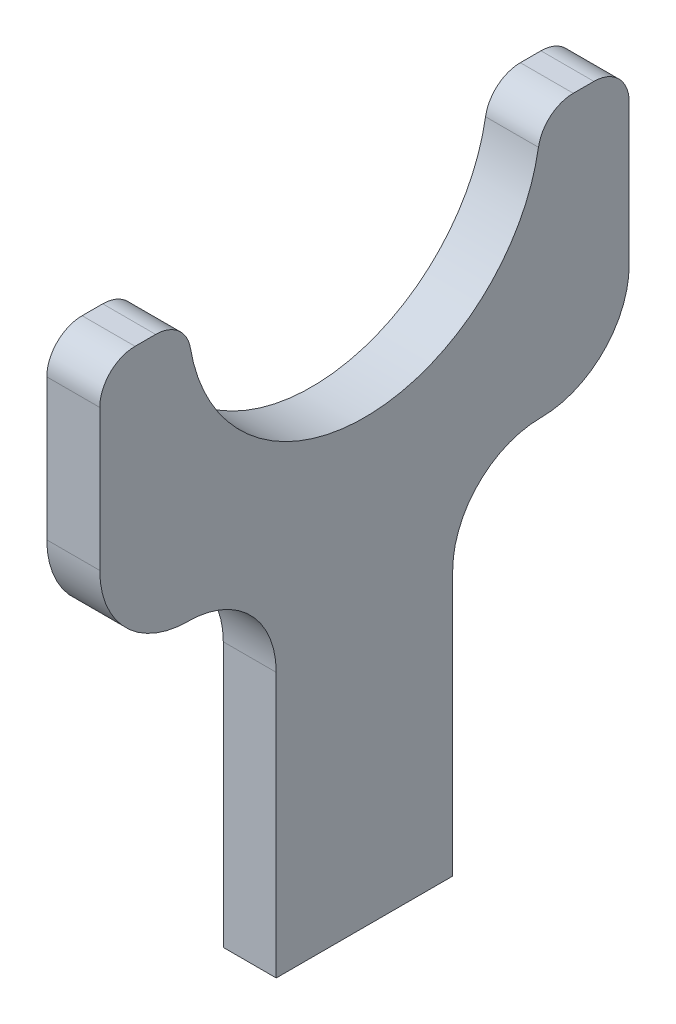
ISO-10303-21;
HEADER;
FILE_DESCRIPTION(('STEP AP214'),'2;1');
FILE_NAME('part.step','',(''),(''),'','','');
FILE_SCHEMA(('AUTOMOTIVE_DESIGN { 1 0 10303 214 1 1 1 1 }'));
ENDSEC;
DATA;
#1=APPLICATION_CONTEXT('core data for automotive mechanical design processes');
#2=APPLICATION_PROTOCOL_DEFINITION('international standard','automotive_design',2000,#1);
#3=PRODUCT_CONTEXT('',#1,'mechanical');
#4=PRODUCT('Part','Part','',(#3));
#5=PRODUCT_RELATED_PRODUCT_CATEGORY('part','',(#4));
#6=PRODUCT_DEFINITION_FORMATION('','',#4);
#7=PRODUCT_DEFINITION_CONTEXT('part definition',#1,'design');
#8=PRODUCT_DEFINITION('design','',#6,#7);
#9=PRODUCT_DEFINITION_SHAPE('','',#8);
#10=(LENGTH_UNIT() NAMED_UNIT(*) SI_UNIT(.MILLI.,.METRE.));
#11=(NAMED_UNIT(*) PLANE_ANGLE_UNIT() SI_UNIT($,.RADIAN.));
#12=(NAMED_UNIT(*) SI_UNIT($,.STERADIAN.) SOLID_ANGLE_UNIT());
#13=UNCERTAINTY_MEASURE_WITH_UNIT(LENGTH_MEASURE(1.E-05),#10,'distance_accuracy_value','');
#14=(GEOMETRIC_REPRESENTATION_CONTEXT(3) GLOBAL_UNCERTAINTY_ASSIGNED_CONTEXT((#13)) GLOBAL_UNIT_ASSIGNED_CONTEXT((#10,
#11,#12)) REPRESENTATION_CONTEXT('',''));
#15=CARTESIAN_POINT('',(0.,0.,0.));
#16=DIRECTION('',(0.,0.,1.));
#17=DIRECTION('',(1.,0.,0.));
#18=AXIS2_PLACEMENT_3D('',#15,#16,#17);
#19=CARTESIAN_POINT('',(3.,35.,0.));
#20=DIRECTION('',(0.,-1.,0.));
#21=DIRECTION('',(0.,0.,-1.));
#22=AXIS2_PLACEMENT_3D('',#19,#20,#21);
#23=PLANE('',#22);
#24=DIRECTION('',(0.,0.,1.));
#25=VECTOR('',#24,1.);
#26=CARTESIAN_POINT('',(3.,35.,0.));
#27=LINE('',#26,#25);
#28=CARTESIAN_POINT('',(3.,35.,-28.));
#29=VERTEX_POINT('',#28);
#30=CARTESIAN_POINT('',(3.,35.,-26.8321595661992));
#31=VERTEX_POINT('',#30);
#32=EDGE_CURVE('E189',#29,#31,#27,.T.);
#33=ORIENTED_EDGE('',*,*,#32,.F.);
#34=DIRECTION('',(-1.,0.,0.));
#35=VECTOR('',#34,1.);
#36=CARTESIAN_POINT('',(3.,35.,-28.));
#37=LINE('',#36,#35);
#38=CARTESIAN_POINT('',(0.,35.,-28.));
#39=VERTEX_POINT('',#38);
#40=EDGE_CURVE('E225',#29,#39,#37,.T.);
#41=ORIENTED_EDGE('',*,*,#40,.T.);
#42=DIRECTION('',(0.,0.,1.));
#43=VECTOR('',#42,1.);
#44=CARTESIAN_POINT('',(0.,35.,0.));
#45=LINE('',#44,#43);
#46=CARTESIAN_POINT('',(0.,35.,-26.8321595661992));
#47=VERTEX_POINT('',#46);
#48=EDGE_CURVE('E184',#39,#47,#45,.T.);
#49=ORIENTED_EDGE('',*,*,#48,.T.);
#50=DIRECTION('',(1.,0.,0.));
#51=VECTOR('',#50,1.);
#52=CARTESIAN_POINT('',(3.,35.,-26.8321595661992));
#53=LINE('',#52,#51);
#54=EDGE_CURVE('E215',#47,#31,#53,.T.);
#55=ORIENTED_EDGE('',*,*,#54,.T.);
#56=EDGE_LOOP('',(#33,#41,#49,#55));
#57=FACE_BOUND('',#56,.T.);
#58=ADVANCED_FACE('F33',(#57),#23,.F.);
#59=CARTESIAN_POINT('',(3.,0.,0.));
#60=DIRECTION('',(0.,0.,-1.));
#61=DIRECTION('',(-1.,0.,0.));
#62=AXIS2_PLACEMENT_3D('',#59,#60,#61);
#63=PLANE('',#62);
#64=DIRECTION('',(0.,-1.,0.));
#65=VECTOR('',#64,1.);
#66=CARTESIAN_POINT('',(3.,0.,0.));
#67=LINE('',#66,#65);
#68=CARTESIAN_POINT('',(3.,33.,0.));
#69=VERTEX_POINT('',#68);
#70=CARTESIAN_POINT('',(3.,25.,0.));
#71=VERTEX_POINT('',#70);
#72=EDGE_CURVE('E262',#69,#71,#67,.T.);
#73=ORIENTED_EDGE('',*,*,#72,.F.);
#74=DIRECTION('',(-1.,0.,0.));
#75=VECTOR('',#74,1.);
#76=CARTESIAN_POINT('',(3.,33.,0.));
#77=LINE('',#76,#75);
#78=CARTESIAN_POINT('',(0.,33.,0.));
#79=VERTEX_POINT('',#78);
#80=EDGE_CURVE('E11',#69,#79,#77,.T.);
#81=ORIENTED_EDGE('',*,*,#80,.T.);
#82=DIRECTION('',(0.,-1.,0.));
#83=VECTOR('',#82,1.);
#84=CARTESIAN_POINT('',(0.,0.,0.));
#85=LINE('',#84,#83);
#86=CARTESIAN_POINT('',(0.,25.,0.));
#87=VERTEX_POINT('',#86);
#88=EDGE_CURVE('E168',#79,#87,#85,.T.);
#89=ORIENTED_EDGE('',*,*,#88,.T.);
#90=DIRECTION('',(1.,0.,0.));
#91=VECTOR('',#90,1.);
#92=CARTESIAN_POINT('',(3.,25.,0.));
#93=LINE('',#92,#91);
#94=EDGE_CURVE('E203',#87,#71,#93,.T.);
#95=ORIENTED_EDGE('',*,*,#94,.T.);
#96=EDGE_LOOP('',(#73,#81,#89,#95));
#97=FACE_BOUND('',#96,.T.);
#98=ADVANCED_FACE('F261',(#97),#63,.F.);
#99=CARTESIAN_POINT('',(3.,0.,0.));
#100=DIRECTION('',(0.,1.,0.));
#101=DIRECTION('',(0.,0.,1.));
#102=AXIS2_PLACEMENT_3D('',#99,#100,#101);
#103=PLANE('',#102);
#104=DIRECTION('',(0.,0.,-1.));
#105=VECTOR('',#104,1.);
#106=CARTESIAN_POINT('',(3.,0.,0.));
#107=LINE('',#106,#105);
#108=CARTESIAN_POINT('',(3.,0.,-10.));
#109=VERTEX_POINT('',#108);
#110=CARTESIAN_POINT('',(3.,0.,-20.));
#111=VERTEX_POINT('',#110);
#112=EDGE_CURVE('E167',#109,#111,#107,.T.);
#113=ORIENTED_EDGE('',*,*,#112,.F.);
#114=DIRECTION('',(1.,0.,0.));
#115=VECTOR('',#114,1.);
#116=CARTESIAN_POINT('',(0.,0.,-10.));
#117=LINE('',#116,#115);
#118=CARTESIAN_POINT('',(0.,0.,-10.));
#119=VERTEX_POINT('',#118);
#120=EDGE_CURVE('E151',#119,#109,#117,.T.);
#121=ORIENTED_EDGE('',*,*,#120,.F.);
#122=DIRECTION('',(0.,0.,-1.));
#123=VECTOR('',#122,1.);
#124=CARTESIAN_POINT('',(0.,0.,0.));
#125=LINE('',#124,#123);
#126=CARTESIAN_POINT('',(0.,0.,-20.));
#127=VERTEX_POINT('',#126);
#128=EDGE_CURVE('E165',#119,#127,#125,.T.);
#129=ORIENTED_EDGE('',*,*,#128,.T.);
#130=DIRECTION('',(1.,0.,0.));
#131=VECTOR('',#130,1.);
#132=CARTESIAN_POINT('',(0.,0.,-20.));
#133=LINE('',#132,#131);
#134=EDGE_CURVE('E270',#127,#111,#133,.T.);
#135=ORIENTED_EDGE('',*,*,#134,.T.);
#136=EDGE_LOOP('',(#113,#121,#129,#135));
#137=FACE_BOUND('',#136,.T.);
#138=ADVANCED_FACE('F163',(#137),#103,.F.);
#139=CARTESIAN_POINT('',(3.,0.,-30.));
#140=DIRECTION('',(0.,0.,1.));
#141=DIRECTION('',(1.,0.,0.));
#142=AXIS2_PLACEMENT_3D('',#139,#140,#141);
#143=PLANE('',#142);
#144=DIRECTION('',(0.,1.,0.));
#145=VECTOR('',#144,1.);
#146=CARTESIAN_POINT('',(0.,0.,-30.));
#147=LINE('',#146,#145);
#148=CARTESIAN_POINT('',(0.,25.,-30.));
#149=VERTEX_POINT('',#148);
#150=CARTESIAN_POINT('',(0.,33.,-30.));
#151=VERTEX_POINT('',#150);
#152=EDGE_CURVE('E175',#149,#151,#147,.T.);
#153=ORIENTED_EDGE('',*,*,#152,.T.);
#154=DIRECTION('',(-1.,0.,0.));
#155=VECTOR('',#154,1.);
#156=CARTESIAN_POINT('',(3.,33.,-30.));
#157=LINE('',#156,#155);
#158=CARTESIAN_POINT('',(3.,33.,-30.));
#159=VERTEX_POINT('',#158);
#160=EDGE_CURVE('E236',#151,#159,#157,.F.);
#161=ORIENTED_EDGE('',*,*,#160,.T.);
#162=DIRECTION('',(0.,1.,0.));
#163=VECTOR('',#162,1.);
#164=CARTESIAN_POINT('',(3.,0.,-30.));
#165=LINE('',#164,#163);
#166=CARTESIAN_POINT('',(3.,25.,-30.));
#167=VERTEX_POINT('',#166);
#168=EDGE_CURVE('E266',#167,#159,#165,.T.);
#169=ORIENTED_EDGE('',*,*,#168,.F.);
#170=DIRECTION('',(1.,0.,0.));
#171=VECTOR('',#170,1.);
#172=CARTESIAN_POINT('',(3.,25.,-30.));
#173=LINE('',#172,#171);
#174=EDGE_CURVE('E193',#167,#149,#173,.F.);
#175=ORIENTED_EDGE('',*,*,#174,.T.);
#176=EDGE_LOOP('',(#153,#161,#169,#175));
#177=FACE_BOUND('',#176,.T.);
#178=ADVANCED_FACE('F288',(#177),#143,.F.);
#179=CARTESIAN_POINT('',(3.,35.,-3.16784043380077));
#180=VERTEX_POINT('',#179);
#181=CARTESIAN_POINT('',(3.,35.,-2.));
#182=VERTEX_POINT('',#181);
#183=EDGE_CURVE('E253',#180,#182,#27,.T.);
#184=ORIENTED_EDGE('',*,*,#183,.F.);
#185=DIRECTION('',(1.,0.,0.));
#186=VECTOR('',#185,1.);
#187=CARTESIAN_POINT('',(3.,35.,-3.16784043380077));
#188=LINE('',#187,#186);
#189=CARTESIAN_POINT('',(0.,35.,-3.16784043380077));
#190=VERTEX_POINT('',#189);
#191=EDGE_CURVE('E41',#180,#190,#188,.F.);
#192=ORIENTED_EDGE('',*,*,#191,.T.);
#193=CARTESIAN_POINT('',(0.,35.,-2.));
#194=VERTEX_POINT('',#193);
#195=EDGE_CURVE('E178',#190,#194,#45,.T.);
#196=ORIENTED_EDGE('',*,*,#195,.T.);
#197=DIRECTION('',(-1.,0.,0.));
#198=VECTOR('',#197,1.);
#199=CARTESIAN_POINT('',(3.,35.,-2.));
#200=LINE('',#199,#198);
#201=EDGE_CURVE('E56',#194,#182,#200,.F.);
#202=ORIENTED_EDGE('',*,*,#201,.T.);
#203=EDGE_LOOP('',(#184,#192,#196,#202));
#204=FACE_BOUND('',#203,.T.);
#205=ADVANCED_FACE('F252',(#204),#23,.F.);
#206=CARTESIAN_POINT('',(3.,0.,0.));
#207=DIRECTION('',(-1.,0.,0.));
#208=DIRECTION('',(0.,0.,1.));
#209=AXIS2_PLACEMENT_3D('',#206,#207,#208);
#210=PLANE('',#209);
#211=ORIENTED_EDGE('',*,*,#168,.T.);
#212=CARTESIAN_POINT('',(3.,33.,-28.));
#213=DIRECTION('',(-1.,0.,0.));
#214=DIRECTION('',(0.,0.,1.));
#215=AXIS2_PLACEMENT_3D('',#212,#213,#214);
#216=CIRCLE('',#215,2.);
#217=EDGE_CURVE('E243',#159,#29,#216,.F.);
#218=ORIENTED_EDGE('',*,*,#217,.T.);
#219=ORIENTED_EDGE('',*,*,#32,.T.);
#220=CARTESIAN_POINT('',(3.,33.,-26.8321595661992));
#221=DIRECTION('',(-1.,0.,0.));
#222=DIRECTION('',(0.,0.,1.));
#223=AXIS2_PLACEMENT_3D('',#220,#221,#222);
#224=CIRCLE('',#223,2.);
#225=CARTESIAN_POINT('',(3.,33.3333333333333,-24.8601329718327));
#226=VERTEX_POINT('',#225);
#227=EDGE_CURVE('E241',#31,#226,#224,.F.);
#228=ORIENTED_EDGE('',*,*,#227,.T.);
#229=CARTESIAN_POINT('',(3.,35.,-15.));
#230=DIRECTION('',(1.,0.,0.));
#231=DIRECTION('',(0.,0.,-1.));
#232=AXIS2_PLACEMENT_3D('',#229,#230,#231);
#233=CIRCLE('',#232,10.);
#234=CARTESIAN_POINT('',(3.,33.3333333333333,-5.1398670281673));
#235=VERTEX_POINT('',#234);
#236=EDGE_CURVE('E219',#235,#226,#233,.T.);
#237=ORIENTED_EDGE('',*,*,#236,.F.);
#238=CARTESIAN_POINT('',(3.,33.,-3.16784043380077));
#239=DIRECTION('',(-1.,0.,0.));
#240=DIRECTION('',(0.,0.,1.));
#241=AXIS2_PLACEMENT_3D('',#238,#239,#240);
#242=CIRCLE('',#241,2.);
#243=EDGE_CURVE('E239',#235,#180,#242,.F.);
#244=ORIENTED_EDGE('',*,*,#243,.T.);
#245=ORIENTED_EDGE('',*,*,#183,.T.);
#246=CARTESIAN_POINT('',(3.,33.,-2.));
#247=DIRECTION('',(-1.,0.,0.));
#248=DIRECTION('',(0.,0.,1.));
#249=AXIS2_PLACEMENT_3D('',#246,#247,#248);
#250=CIRCLE('',#249,2.);
#251=EDGE_CURVE('E48',#182,#69,#250,.F.);
#252=ORIENTED_EDGE('',*,*,#251,.T.);
#253=ORIENTED_EDGE('',*,*,#72,.T.);
#254=CARTESIAN_POINT('',(3.,25.,-5.));
#255=DIRECTION('',(-1.,0.,0.));
#256=DIRECTION('',(0.,0.,1.));
#257=AXIS2_PLACEMENT_3D('',#254,#255,#256);
#258=CIRCLE('',#257,5.);
#259=CARTESIAN_POINT('',(3.,20.,-5.));
#260=VERTEX_POINT('',#259);
#261=EDGE_CURVE('E188',#71,#260,#258,.F.);
#262=ORIENTED_EDGE('',*,*,#261,.T.);
#263=CARTESIAN_POINT('',(3.,15.,-5.));
#264=DIRECTION('',(-1.,0.,0.));
#265=DIRECTION('',(0.,0.,1.));
#266=AXIS2_PLACEMENT_3D('',#263,#264,#265);
#267=CIRCLE('',#266,5.);
#268=CARTESIAN_POINT('',(3.,15.,-10.));
#269=VERTEX_POINT('',#268);
#270=EDGE_CURVE('E211',#260,#269,#267,.T.);
#271=ORIENTED_EDGE('',*,*,#270,.T.);
#272=DIRECTION('',(0.,1.,0.));
#273=VECTOR('',#272,1.);
#274=CARTESIAN_POINT('',(3.,0.,-10.));
#275=LINE('',#274,#273);
#276=EDGE_CURVE('E158',#109,#269,#275,.T.);
#277=ORIENTED_EDGE('',*,*,#276,.F.);
#278=ORIENTED_EDGE('',*,*,#112,.T.);
#279=DIRECTION('',(0.,-1.,0.));
#280=VECTOR('',#279,1.);
#281=CARTESIAN_POINT('',(3.,0.,-20.));
#282=LINE('',#281,#280);
#283=CARTESIAN_POINT('',(3.,15.,-20.));
#284=VERTEX_POINT('',#283);
#285=EDGE_CURVE('E303',#284,#111,#282,.T.);
#286=ORIENTED_EDGE('',*,*,#285,.F.);
#287=CARTESIAN_POINT('',(3.,15.,-25.));
#288=DIRECTION('',(-1.,0.,0.));
#289=DIRECTION('',(0.,0.,1.));
#290=AXIS2_PLACEMENT_3D('',#287,#288,#289);
#291=CIRCLE('',#290,5.);
#292=CARTESIAN_POINT('',(3.,20.,-25.));
#293=VERTEX_POINT('',#292);
#294=EDGE_CURVE('E207',#284,#293,#291,.T.);
#295=ORIENTED_EDGE('',*,*,#294,.T.);
#296=CARTESIAN_POINT('',(3.,25.,-25.));
#297=DIRECTION('',(-1.,0.,0.));
#298=DIRECTION('',(0.,0.,1.));
#299=AXIS2_PLACEMENT_3D('',#296,#297,#298);
#300=CIRCLE('',#299,5.);
#301=EDGE_CURVE('E191',#293,#167,#300,.F.);
#302=ORIENTED_EDGE('',*,*,#301,.T.);
#303=EDGE_LOOP('',(#211,#218,#219,#228,#237,#244,#245,#252,#253,#262,#271,#277,#278,#286,#295,#302));
#304=FACE_BOUND('',#303,.T.);
#305=ADVANCED_FACE('F276',(#304),#210,.F.);
#306=CARTESIAN_POINT('',(0.,0.,0.));
#307=DIRECTION('',(-1.,0.,0.));
#308=DIRECTION('',(0.,0.,1.));
#309=AXIS2_PLACEMENT_3D('',#306,#307,#308);
#310=PLANE('',#309);
#311=ORIENTED_EDGE('',*,*,#48,.F.);
#312=CARTESIAN_POINT('',(0.,33.,-28.));
#313=DIRECTION('',(-1.,0.,0.));
#314=DIRECTION('',(0.,0.,1.));
#315=AXIS2_PLACEMENT_3D('',#312,#313,#314);
#316=CIRCLE('',#315,2.);
#317=EDGE_CURVE('E234',#39,#151,#316,.T.);
#318=ORIENTED_EDGE('',*,*,#317,.T.);
#319=ORIENTED_EDGE('',*,*,#152,.F.);
#320=CARTESIAN_POINT('',(0.,25.,-25.));
#321=DIRECTION('',(-1.,0.,0.));
#322=DIRECTION('',(0.,0.,1.));
#323=AXIS2_PLACEMENT_3D('',#320,#321,#322);
#324=CIRCLE('',#323,5.);
#325=CARTESIAN_POINT('',(0.,20.,-25.));
#326=VERTEX_POINT('',#325);
#327=EDGE_CURVE('E199',#149,#326,#324,.T.);
#328=ORIENTED_EDGE('',*,*,#327,.T.);
#329=CARTESIAN_POINT('',(0.,15.,-25.));
#330=DIRECTION('',(-1.,0.,0.));
#331=DIRECTION('',(0.,0.,1.));
#332=AXIS2_PLACEMENT_3D('',#329,#330,#331);
#333=CIRCLE('',#332,5.);
#334=CARTESIAN_POINT('',(0.,15.,-20.));
#335=VERTEX_POINT('',#334);
#336=EDGE_CURVE('E209',#326,#335,#333,.F.);
#337=ORIENTED_EDGE('',*,*,#336,.T.);
#338=DIRECTION('',(0.,-1.,0.));
#339=VECTOR('',#338,1.);
#340=CARTESIAN_POINT('',(0.,0.,-20.));
#341=LINE('',#340,#339);
#342=EDGE_CURVE('E173',#335,#127,#341,.T.);
#343=ORIENTED_EDGE('',*,*,#342,.T.);
#344=ORIENTED_EDGE('',*,*,#128,.F.);
#345=DIRECTION('',(0.,1.,0.));
#346=VECTOR('',#345,1.);
#347=CARTESIAN_POINT('',(0.,0.,-10.));
#348=LINE('',#347,#346);
#349=CARTESIAN_POINT('',(0.,15.,-10.));
#350=VERTEX_POINT('',#349);
#351=EDGE_CURVE('E147',#119,#350,#348,.T.);
#352=ORIENTED_EDGE('',*,*,#351,.T.);
#353=CARTESIAN_POINT('',(0.,15.,-5.));
#354=DIRECTION('',(-1.,0.,0.));
#355=DIRECTION('',(0.,0.,1.));
#356=AXIS2_PLACEMENT_3D('',#353,#354,#355);
#357=CIRCLE('',#356,5.);
#358=CARTESIAN_POINT('',(0.,20.,-5.));
#359=VERTEX_POINT('',#358);
#360=EDGE_CURVE('E213',#350,#359,#357,.F.);
#361=ORIENTED_EDGE('',*,*,#360,.T.);
#362=CARTESIAN_POINT('',(0.,25.,-5.));
#363=DIRECTION('',(-1.,0.,0.));
#364=DIRECTION('',(0.,0.,1.));
#365=AXIS2_PLACEMENT_3D('',#362,#363,#364);
#366=CIRCLE('',#365,5.);
#367=EDGE_CURVE('E196',#359,#87,#366,.T.);
#368=ORIENTED_EDGE('',*,*,#367,.T.);
#369=ORIENTED_EDGE('',*,*,#88,.F.);
#370=CARTESIAN_POINT('',(0.,33.,-2.));
#371=DIRECTION('',(-1.,0.,0.));
#372=DIRECTION('',(0.,0.,1.));
#373=AXIS2_PLACEMENT_3D('',#370,#371,#372);
#374=CIRCLE('',#373,2.);
#375=EDGE_CURVE('E228',#79,#194,#374,.T.);
#376=ORIENTED_EDGE('',*,*,#375,.T.);
#377=ORIENTED_EDGE('',*,*,#195,.F.);
#378=CARTESIAN_POINT('',(0.,33.,-3.16784043380077));
#379=DIRECTION('',(-1.,0.,0.));
#380=DIRECTION('',(0.,0.,1.));
#381=AXIS2_PLACEMENT_3D('',#378,#379,#380);
#382=CIRCLE('',#381,2.);
#383=CARTESIAN_POINT('',(0.,33.3333333333333,-5.1398670281673));
#384=VERTEX_POINT('',#383);
#385=EDGE_CURVE('E230',#190,#384,#382,.T.);
#386=ORIENTED_EDGE('',*,*,#385,.T.);
#387=CARTESIAN_POINT('',(0.,35.,-15.));
#388=DIRECTION('',(-1.,0.,0.));
#389=DIRECTION('',(0.,0.,1.));
#390=AXIS2_PLACEMENT_3D('',#387,#388,#389);
#391=CIRCLE('',#390,10.);
#392=CARTESIAN_POINT('',(0.,33.3333333333333,-24.8601329718327));
#393=VERTEX_POINT('',#392);
#394=EDGE_CURVE('E185',#393,#384,#391,.T.);
#395=ORIENTED_EDGE('',*,*,#394,.F.);
#396=CARTESIAN_POINT('',(0.,33.,-26.8321595661992));
#397=DIRECTION('',(-1.,0.,0.));
#398=DIRECTION('',(0.,0.,1.));
#399=AXIS2_PLACEMENT_3D('',#396,#397,#398);
#400=CIRCLE('',#399,2.);
#401=EDGE_CURVE('E232',#393,#47,#400,.T.);
#402=ORIENTED_EDGE('',*,*,#401,.T.);
#403=EDGE_LOOP('',(#311,#318,#319,#328,#337,#343,#344,#352,#361,#368,#369,#376,#377,#386,#395,#402));
#404=FACE_BOUND('',#403,.T.);
#405=ADVANCED_FACE('F171',(#404),#310,.T.);
#406=CARTESIAN_POINT('',(0.,0.,-20.));
#407=DIRECTION('',(0.,0.,1.));
#408=DIRECTION('',(1.,0.,0.));
#409=AXIS2_PLACEMENT_3D('',#406,#407,#408);
#410=PLANE('',#409);
#411=ORIENTED_EDGE('',*,*,#342,.F.);
#412=DIRECTION('',(1.,0.,0.));
#413=VECTOR('',#412,1.);
#414=CARTESIAN_POINT('',(3.,15.,-20.));
#415=LINE('',#414,#413);
#416=EDGE_CURVE('E201',#335,#284,#415,.T.);
#417=ORIENTED_EDGE('',*,*,#416,.T.);
#418=ORIENTED_EDGE('',*,*,#285,.T.);
#419=ORIENTED_EDGE('',*,*,#134,.F.);
#420=EDGE_LOOP('',(#411,#417,#418,#419));
#421=FACE_BOUND('',#420,.T.);
#422=ADVANCED_FACE('F302',(#421),#410,.F.);
#423=CARTESIAN_POINT('',(0.,0.,-10.));
#424=DIRECTION('',(0.,0.,-1.));
#425=DIRECTION('',(-1.,0.,0.));
#426=AXIS2_PLACEMENT_3D('',#423,#424,#425);
#427=PLANE('',#426);
#428=ORIENTED_EDGE('',*,*,#276,.T.);
#429=DIRECTION('',(1.,0.,0.));
#430=VECTOR('',#429,1.);
#431=CARTESIAN_POINT('',(0.,15.,-10.));
#432=LINE('',#431,#430);
#433=EDGE_CURVE('E154',#269,#350,#432,.F.);
#434=ORIENTED_EDGE('',*,*,#433,.T.);
#435=ORIENTED_EDGE('',*,*,#351,.F.);
#436=ORIENTED_EDGE('',*,*,#120,.T.);
#437=EDGE_LOOP('',(#428,#434,#435,#436));
#438=FACE_BOUND('',#437,.T.);
#439=ADVANCED_FACE('F150',(#438),#427,.F.);
#440=CARTESIAN_POINT('',(0.,35.,-15.));
#441=DIRECTION('',(1.,0.,0.));
#442=DIRECTION('',(0.,0.,-1.));
#443=AXIS2_PLACEMENT_3D('',#440,#441,#442);
#444=CYLINDRICAL_SURFACE('',#443,10.);
#445=ORIENTED_EDGE('',*,*,#236,.T.);
#446=DIRECTION('',(1.,0.,0.));
#447=VECTOR('',#446,1.);
#448=CARTESIAN_POINT('',(0.,33.3333333333333,-24.8601329718327));
#449=LINE('',#448,#447);
#450=EDGE_CURVE('E247',#226,#393,#449,.F.);
#451=ORIENTED_EDGE('',*,*,#450,.T.);
#452=ORIENTED_EDGE('',*,*,#394,.T.);
#453=DIRECTION('',(1.,0.,0.));
#454=VECTOR('',#453,1.);
#455=CARTESIAN_POINT('',(0.,33.3333333333333,-5.1398670281673));
#456=LINE('',#455,#454);
#457=EDGE_CURVE('E245',#384,#235,#456,.T.);
#458=ORIENTED_EDGE('',*,*,#457,.T.);
#459=EDGE_LOOP('',(#445,#451,#452,#458));
#460=FACE_BOUND('',#459,.T.);
#461=ADVANCED_FACE('F345',(#460),#444,.F.);
#462=CARTESIAN_POINT('',(0.,15.,-25.));
#463=DIRECTION('',(-1.,0.,0.));
#464=DIRECTION('',(0.,0.,1.));
#465=AXIS2_PLACEMENT_3D('',#462,#463,#464);
#466=CYLINDRICAL_SURFACE('',#465,5.);
#467=ORIENTED_EDGE('',*,*,#416,.F.);
#468=ORIENTED_EDGE('',*,*,#336,.F.);
#469=DIRECTION('',(1.,0.,0.));
#470=VECTOR('',#469,1.);
#471=CARTESIAN_POINT('',(0.,20.,-25.));
#472=LINE('',#471,#470);
#473=EDGE_CURVE('E216',#293,#326,#472,.F.);
#474=ORIENTED_EDGE('',*,*,#473,.F.);
#475=ORIENTED_EDGE('',*,*,#294,.F.);
#476=EDGE_LOOP('',(#467,#468,#474,#475));
#477=FACE_BOUND('',#476,.T.);
#478=ADVANCED_FACE('F298',(#477),#466,.F.);
#479=CARTESIAN_POINT('',(0.,25.,-25.));
#480=DIRECTION('',(1.,0.,0.));
#481=DIRECTION('',(0.,0.,-1.));
#482=AXIS2_PLACEMENT_3D('',#479,#480,#481);
#483=CYLINDRICAL_SURFACE('',#482,5.);
#484=ORIENTED_EDGE('',*,*,#327,.F.);
#485=ORIENTED_EDGE('',*,*,#174,.F.);
#486=ORIENTED_EDGE('',*,*,#301,.F.);
#487=ORIENTED_EDGE('',*,*,#473,.T.);
#488=EDGE_LOOP('',(#484,#485,#486,#487));
#489=FACE_BOUND('',#488,.T.);
#490=ADVANCED_FACE('F293',(#489),#483,.T.);
#491=CARTESIAN_POINT('',(0.,15.,-5.));
#492=DIRECTION('',(-1.,0.,0.));
#493=DIRECTION('',(0.,0.,1.));
#494=AXIS2_PLACEMENT_3D('',#491,#492,#493);
#495=CYLINDRICAL_SURFACE('',#494,5.);
#496=DIRECTION('',(1.,0.,0.));
#497=VECTOR('',#496,1.);
#498=CARTESIAN_POINT('',(3.,20.,-5.));
#499=LINE('',#498,#497);
#500=EDGE_CURVE('E220',#359,#260,#499,.T.);
#501=ORIENTED_EDGE('',*,*,#500,.F.);
#502=ORIENTED_EDGE('',*,*,#360,.F.);
#503=ORIENTED_EDGE('',*,*,#433,.F.);
#504=ORIENTED_EDGE('',*,*,#270,.F.);
#505=EDGE_LOOP('',(#501,#502,#503,#504));
#506=FACE_BOUND('',#505,.T.);
#507=ADVANCED_FACE('F310',(#506),#495,.F.);
#508=CARTESIAN_POINT('',(3.,25.,-5.));
#509=DIRECTION('',(1.,0.,0.));
#510=DIRECTION('',(0.,0.,-1.));
#511=AXIS2_PLACEMENT_3D('',#508,#509,#510);
#512=CYLINDRICAL_SURFACE('',#511,5.);
#513=ORIENTED_EDGE('',*,*,#367,.F.);
#514=ORIENTED_EDGE('',*,*,#500,.T.);
#515=ORIENTED_EDGE('',*,*,#261,.F.);
#516=ORIENTED_EDGE('',*,*,#94,.F.);
#517=EDGE_LOOP('',(#513,#514,#515,#516));
#518=FACE_BOUND('',#517,.T.);
#519=ADVANCED_FACE('F313',(#518),#512,.T.);
#520=CARTESIAN_POINT('',(3.,33.,-28.));
#521=DIRECTION('',(-1.,0.,0.));
#522=DIRECTION('',(0.,0.,1.));
#523=AXIS2_PLACEMENT_3D('',#520,#521,#522);
#524=CYLINDRICAL_SURFACE('',#523,2.);
#525=ORIENTED_EDGE('',*,*,#217,.F.);
#526=ORIENTED_EDGE('',*,*,#160,.F.);
#527=ORIENTED_EDGE('',*,*,#317,.F.);
#528=ORIENTED_EDGE('',*,*,#40,.F.);
#529=EDGE_LOOP('',(#525,#526,#527,#528));
#530=FACE_BOUND('',#529,.T.);
#531=ADVANCED_FACE('F284',(#530),#524,.T.);
#532=CARTESIAN_POINT('',(0.,33.,-26.8321595661992));
#533=DIRECTION('',(1.,0.,0.));
#534=DIRECTION('',(0.,0.,-1.));
#535=AXIS2_PLACEMENT_3D('',#532,#533,#534);
#536=CYLINDRICAL_SURFACE('',#535,2.);
#537=ORIENTED_EDGE('',*,*,#401,.F.);
#538=ORIENTED_EDGE('',*,*,#450,.F.);
#539=ORIENTED_EDGE('',*,*,#227,.F.);
#540=ORIENTED_EDGE('',*,*,#54,.F.);
#541=EDGE_LOOP('',(#537,#538,#539,#540));
#542=FACE_BOUND('',#541,.T.);
#543=ADVANCED_FACE('F320',(#542),#536,.T.);
#544=CARTESIAN_POINT('',(0.,33.,-3.16784043380077));
#545=DIRECTION('',(1.,0.,0.));
#546=DIRECTION('',(0.,0.,-1.));
#547=AXIS2_PLACEMENT_3D('',#544,#545,#546);
#548=CYLINDRICAL_SURFACE('',#547,2.);
#549=ORIENTED_EDGE('',*,*,#243,.F.);
#550=ORIENTED_EDGE('',*,*,#457,.F.);
#551=ORIENTED_EDGE('',*,*,#385,.F.);
#552=ORIENTED_EDGE('',*,*,#191,.F.);
#553=EDGE_LOOP('',(#549,#550,#551,#552));
#554=FACE_BOUND('',#553,.T.);
#555=ADVANCED_FACE('F441',(#554),#548,.T.);
#556=CARTESIAN_POINT('',(3.,33.,-2.));
#557=DIRECTION('',(-1.,0.,0.));
#558=DIRECTION('',(0.,0.,1.));
#559=AXIS2_PLACEMENT_3D('',#556,#557,#558);
#560=CYLINDRICAL_SURFACE('',#559,2.);
#561=ORIENTED_EDGE('',*,*,#251,.F.);
#562=ORIENTED_EDGE('',*,*,#201,.F.);
#563=ORIENTED_EDGE('',*,*,#375,.F.);
#564=ORIENTED_EDGE('',*,*,#80,.F.);
#565=EDGE_LOOP('',(#561,#562,#563,#564));
#566=FACE_BOUND('',#565,.T.);
#567=ADVANCED_FACE('F35',(#566),#560,.T.);
#568=CLOSED_SHELL('',(#58,#98,#138,#178,#205,#305,#405,#422,#439,#461,#478,#490,#507,#519,#531,
#543,#555,#567));
#569=MANIFOLD_SOLID_BREP('B2',#568);
#570=ADVANCED_BREP_SHAPE_REPRESENTATION('',(#18,#569),#14);
#571=SHAPE_DEFINITION_REPRESENTATION(#9,#570);
ENDSEC;
END-ISO-10303-21;
